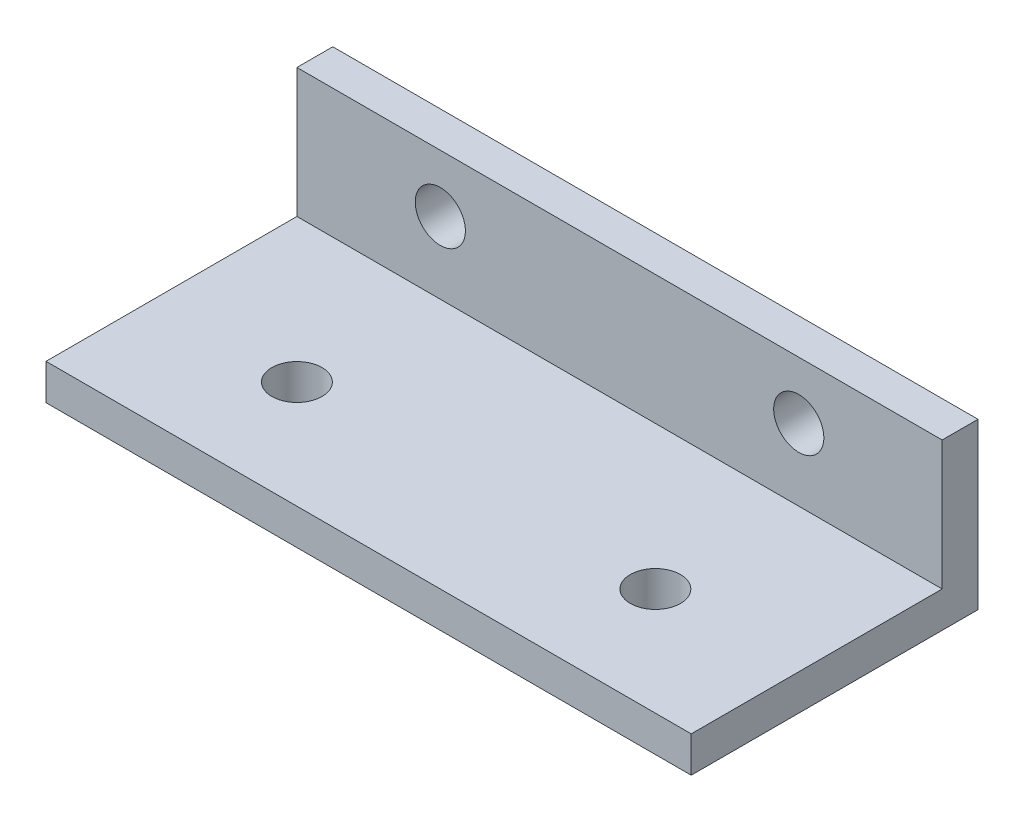
ISO-10303-21;
HEADER;
FILE_DESCRIPTION(('STEP AP214'),'2;1');
FILE_NAME('part.step','',(''),(''),'','','');
FILE_SCHEMA(('AUTOMOTIVE_DESIGN { 1 0 10303 214 1 1 1 1 }'));
ENDSEC;
DATA;
#1=APPLICATION_CONTEXT('core data for automotive mechanical design processes');
#2=APPLICATION_PROTOCOL_DEFINITION('international standard','automotive_design',2000,#1);
#3=PRODUCT_CONTEXT('',#1,'mechanical');
#4=PRODUCT('Part','Part','',(#3));
#5=PRODUCT_RELATED_PRODUCT_CATEGORY('part','',(#4));
#6=PRODUCT_DEFINITION_FORMATION('','',#4);
#7=PRODUCT_DEFINITION_CONTEXT('part definition',#1,'design');
#8=PRODUCT_DEFINITION('design','',#6,#7);
#9=PRODUCT_DEFINITION_SHAPE('','',#8);
#10=(LENGTH_UNIT() NAMED_UNIT(*) SI_UNIT(.MILLI.,.METRE.));
#11=(NAMED_UNIT(*) PLANE_ANGLE_UNIT() SI_UNIT($,.RADIAN.));
#12=(NAMED_UNIT(*) SI_UNIT($,.STERADIAN.) SOLID_ANGLE_UNIT());
#13=UNCERTAINTY_MEASURE_WITH_UNIT(LENGTH_MEASURE(1.E-05),#10,'distance_accuracy_value','');
#14=(GEOMETRIC_REPRESENTATION_CONTEXT(3) GLOBAL_UNCERTAINTY_ASSIGNED_CONTEXT((#13)) GLOBAL_UNIT_ASSIGNED_CONTEXT((#10,
#11,#12)) REPRESENTATION_CONTEXT('',''));
#15=CARTESIAN_POINT('',(0.,0.,0.));
#16=DIRECTION('',(0.,0.,1.));
#17=DIRECTION('',(1.,0.,0.));
#18=AXIS2_PLACEMENT_3D('',#15,#16,#17);
#19=CARTESIAN_POINT('',(45.,0.,5.));
#20=DIRECTION('',(-1.,0.,0.));
#21=DIRECTION('',(0.,-1.,0.));
#22=AXIS2_PLACEMENT_3D('',#19,#20,#21);
#23=PLANE('',#22);
#24=DIRECTION('',(0.,1.,0.));
#25=VECTOR('',#24,1.);
#26=CARTESIAN_POINT('',(45.,0.,0.));
#27=LINE('',#26,#25);
#28=CARTESIAN_POINT('',(45.,-23.,0.));
#29=VERTEX_POINT('',#28);
#30=CARTESIAN_POINT('',(45.,0.,0.));
#31=VERTEX_POINT('',#30);
#32=EDGE_CURVE('E96',#29,#31,#27,.T.);
#33=ORIENTED_EDGE('',*,*,#32,.T.);
#34=DIRECTION('',(0.,0.,-1.));
#35=VECTOR('',#34,1.);
#36=CARTESIAN_POINT('',(45.,0.,5.));
#37=LINE('',#36,#35);
#38=CARTESIAN_POINT('',(45.,0.,5.));
#39=VERTEX_POINT('',#38);
#40=EDGE_CURVE('E11',#39,#31,#37,.T.);
#41=ORIENTED_EDGE('',*,*,#40,.F.);
#42=DIRECTION('',(0.,1.,0.));
#43=VECTOR('',#42,1.);
#44=CARTESIAN_POINT('',(45.,0.,5.));
#45=LINE('',#44,#43);
#46=CARTESIAN_POINT('',(45.,-18.,5.));
#47=VERTEX_POINT('',#46);
#48=EDGE_CURVE('E89',#47,#39,#45,.T.);
#49=ORIENTED_EDGE('',*,*,#48,.F.);
#50=DIRECTION('',(0.,0.,-1.));
#51=VECTOR('',#50,1.);
#52=CARTESIAN_POINT('',(45.,-18.,40.));
#53=LINE('',#52,#51);
#54=CARTESIAN_POINT('',(45.,-18.,40.));
#55=VERTEX_POINT('',#54);
#56=EDGE_CURVE('E104',#55,#47,#53,.T.);
#57=ORIENTED_EDGE('',*,*,#56,.F.);
#58=DIRECTION('',(0.,1.,0.));
#59=VECTOR('',#58,1.);
#60=CARTESIAN_POINT('',(45.,-18.,40.));
#61=LINE('',#60,#59);
#62=CARTESIAN_POINT('',(45.,-23.,40.));
#63=VERTEX_POINT('',#62);
#64=EDGE_CURVE('E99',#63,#55,#61,.T.);
#65=ORIENTED_EDGE('',*,*,#64,.F.);
#66=DIRECTION('',(0.,0.,-1.));
#67=VECTOR('',#66,1.);
#68=CARTESIAN_POINT('',(45.,-23.,5.));
#69=LINE('',#68,#67);
#70=EDGE_CURVE('E82',#63,#29,#69,.T.);
#71=ORIENTED_EDGE('',*,*,#70,.T.);
#72=EDGE_LOOP('',(#33,#41,#49,#57,#65,#71));
#73=FACE_BOUND('',#72,.T.);
#74=ADVANCED_FACE('F37',(#73),#23,.F.);
#75=CARTESIAN_POINT('',(45.,0.,5.));
#76=DIRECTION('',(0.,-1.,0.));
#77=DIRECTION('',(1.,0.,0.));
#78=AXIS2_PLACEMENT_3D('',#75,#76,#77);
#79=PLANE('',#78);
#80=DIRECTION('',(-1.,0.,0.));
#81=VECTOR('',#80,1.);
#82=CARTESIAN_POINT('',(45.,0.,0.));
#83=LINE('',#82,#81);
#84=CARTESIAN_POINT('',(-45.,0.,0.));
#85=VERTEX_POINT('',#84);
#86=EDGE_CURVE('E103',#31,#85,#83,.T.);
#87=ORIENTED_EDGE('',*,*,#86,.T.);
#88=DIRECTION('',(0.,0.,-1.));
#89=VECTOR('',#88,1.);
#90=CARTESIAN_POINT('',(-45.,0.,5.));
#91=LINE('',#90,#89);
#92=CARTESIAN_POINT('',(-45.,0.,5.));
#93=VERTEX_POINT('',#92);
#94=EDGE_CURVE('E44',#93,#85,#91,.T.);
#95=ORIENTED_EDGE('',*,*,#94,.F.);
#96=DIRECTION('',(-1.,0.,0.));
#97=VECTOR('',#96,1.);
#98=CARTESIAN_POINT('',(45.,0.,5.));
#99=LINE('',#98,#97);
#100=EDGE_CURVE('E57',#39,#93,#99,.T.);
#101=ORIENTED_EDGE('',*,*,#100,.F.);
#102=ORIENTED_EDGE('',*,*,#40,.T.);
#103=EDGE_LOOP('',(#87,#95,#101,#102));
#104=FACE_BOUND('',#103,.T.);
#105=ADVANCED_FACE('F120',(#104),#79,.F.);
#106=CARTESIAN_POINT('',(-45.,0.,5.));
#107=DIRECTION('',(1.,0.,0.));
#108=DIRECTION('',(0.,1.,0.));
#109=AXIS2_PLACEMENT_3D('',#106,#107,#108);
#110=PLANE('',#109);
#111=DIRECTION('',(0.,-1.,0.));
#112=VECTOR('',#111,1.);
#113=CARTESIAN_POINT('',(-45.,0.,0.));
#114=LINE('',#113,#112);
#115=CARTESIAN_POINT('',(-45.,-23.,0.));
#116=VERTEX_POINT('',#115);
#117=EDGE_CURVE('E90',#85,#116,#114,.T.);
#118=ORIENTED_EDGE('',*,*,#117,.T.);
#119=DIRECTION('',(0.,0.,-1.));
#120=VECTOR('',#119,1.);
#121=CARTESIAN_POINT('',(-45.,-23.,5.));
#122=LINE('',#121,#120);
#123=CARTESIAN_POINT('',(-45.,-23.,40.));
#124=VERTEX_POINT('',#123);
#125=EDGE_CURVE('E85',#124,#116,#122,.T.);
#126=ORIENTED_EDGE('',*,*,#125,.F.);
#127=DIRECTION('',(0.,-1.,0.));
#128=VECTOR('',#127,1.);
#129=CARTESIAN_POINT('',(-45.,-23.,40.));
#130=LINE('',#129,#128);
#131=CARTESIAN_POINT('',(-45.,-18.,40.));
#132=VERTEX_POINT('',#131);
#133=EDGE_CURVE('E140',#132,#124,#130,.T.);
#134=ORIENTED_EDGE('',*,*,#133,.F.);
#135=DIRECTION('',(0.,0.,-1.));
#136=VECTOR('',#135,1.);
#137=CARTESIAN_POINT('',(-45.,-18.,40.));
#138=LINE('',#137,#136);
#139=CARTESIAN_POINT('',(-45.,-18.,5.));
#140=VERTEX_POINT('',#139);
#141=EDGE_CURVE('E108',#132,#140,#138,.T.);
#142=ORIENTED_EDGE('',*,*,#141,.T.);
#143=DIRECTION('',(0.,-1.,0.));
#144=VECTOR('',#143,1.);
#145=CARTESIAN_POINT('',(-45.,0.,5.));
#146=LINE('',#145,#144);
#147=EDGE_CURVE('E100',#93,#140,#146,.T.);
#148=ORIENTED_EDGE('',*,*,#147,.F.);
#149=ORIENTED_EDGE('',*,*,#94,.T.);
#150=EDGE_LOOP('',(#118,#126,#134,#142,#148,#149));
#151=FACE_BOUND('',#150,.T.);
#152=ADVANCED_FACE('F117',(#151),#110,.F.);
#153=CARTESIAN_POINT('',(-45.,-23.,5.));
#154=DIRECTION('',(0.,1.,0.));
#155=DIRECTION('',(0.,0.,1.));
#156=AXIS2_PLACEMENT_3D('',#153,#154,#155);
#157=PLANE('',#156);
#158=CARTESIAN_POINT('',(-25.,-23.,25.));
#159=DIRECTION('',(0.,1.,0.));
#160=DIRECTION('',(0.,0.,1.));
#161=AXIS2_PLACEMENT_3D('',#158,#159,#160);
#162=CIRCLE('',#161,3.5);
#163=CARTESIAN_POINT('',(-25.,-23.,28.5));
#164=VERTEX_POINT('',#163);
#165=EDGE_CURVE('E167',#164,#164,#162,.T.);
#166=ORIENTED_EDGE('',*,*,#165,.T.);
#167=EDGE_LOOP('',(#166));
#168=FACE_BOUND('',#167,.T.);
#169=CARTESIAN_POINT('',(25.,-23.,25.));
#170=DIRECTION('',(0.,1.,0.));
#171=DIRECTION('',(0.,0.,1.));
#172=AXIS2_PLACEMENT_3D('',#169,#170,#171);
#173=CIRCLE('',#172,3.5);
#174=CARTESIAN_POINT('',(25.,-23.,28.5));
#175=VERTEX_POINT('',#174);
#176=EDGE_CURVE('E161',#175,#175,#173,.T.);
#177=ORIENTED_EDGE('',*,*,#176,.T.);
#178=EDGE_LOOP('',(#177));
#179=FACE_BOUND('',#178,.T.);
#180=DIRECTION('',(1.,0.,0.));
#181=VECTOR('',#180,1.);
#182=CARTESIAN_POINT('',(-45.,-23.,0.));
#183=LINE('',#182,#181);
#184=EDGE_CURVE('E77',#116,#29,#183,.T.);
#185=ORIENTED_EDGE('',*,*,#184,.T.);
#186=ORIENTED_EDGE('',*,*,#70,.F.);
#187=DIRECTION('',(1.,0.,0.));
#188=VECTOR('',#187,1.);
#189=CARTESIAN_POINT('',(45.,-23.,40.));
#190=LINE('',#189,#188);
#191=EDGE_CURVE('E136',#124,#63,#190,.T.);
#192=ORIENTED_EDGE('',*,*,#191,.F.);
#193=ORIENTED_EDGE('',*,*,#125,.T.);
#194=EDGE_LOOP('',(#185,#186,#192,#193));
#195=FACE_BOUND('',#194,.T.);
#196=ADVANCED_FACE('F79',(#168,#179,#195),#157,.F.);
#197=CARTESIAN_POINT('',(0.,0.,5.));
#198=DIRECTION('',(0.,0.,1.));
#199=DIRECTION('',(1.,0.,0.));
#200=AXIS2_PLACEMENT_3D('',#197,#198,#199);
#201=PLANE('',#200);
#202=CARTESIAN_POINT('',(-25.,-8.00000000000002,5.));
#203=DIRECTION('',(0.,0.,1.));
#204=DIRECTION('',(1.,0.,0.));
#205=AXIS2_PLACEMENT_3D('',#202,#203,#204);
#206=CIRCLE('',#205,3.49999999999999);
#207=CARTESIAN_POINT('',(-21.5,-8.00000000000002,5.));
#208=VERTEX_POINT('',#207);
#209=EDGE_CURVE('E158',#208,#208,#206,.T.);
#210=ORIENTED_EDGE('',*,*,#209,.F.);
#211=EDGE_LOOP('',(#210));
#212=FACE_BOUND('',#211,.T.);
#213=CARTESIAN_POINT('',(25.,-8.00000000000001,5.));
#214=DIRECTION('',(0.,0.,1.));
#215=DIRECTION('',(1.,0.,0.));
#216=AXIS2_PLACEMENT_3D('',#213,#214,#215);
#217=CIRCLE('',#216,3.49999999999999);
#218=CARTESIAN_POINT('',(28.5,-8.00000000000001,5.));
#219=VERTEX_POINT('',#218);
#220=EDGE_CURVE('E152',#219,#219,#217,.T.);
#221=ORIENTED_EDGE('',*,*,#220,.F.);
#222=EDGE_LOOP('',(#221));
#223=FACE_BOUND('',#222,.T.);
#224=DIRECTION('',(-1.,0.,0.));
#225=VECTOR('',#224,1.);
#226=CARTESIAN_POINT('',(-45.,-18.,5.));
#227=LINE('',#226,#225);
#228=EDGE_CURVE('E51',#47,#140,#227,.T.);
#229=ORIENTED_EDGE('',*,*,#228,.F.);
#230=ORIENTED_EDGE('',*,*,#48,.T.);
#231=ORIENTED_EDGE('',*,*,#100,.T.);
#232=ORIENTED_EDGE('',*,*,#147,.T.);
#233=EDGE_LOOP('',(#229,#230,#231,#232));
#234=FACE_BOUND('',#233,.T.);
#235=ADVANCED_FACE('F142',(#212,#223,#234),#201,.T.);
#236=CARTESIAN_POINT('',(0.,0.,0.));
#237=DIRECTION('',(0.,0.,1.));
#238=DIRECTION('',(1.,0.,0.));
#239=AXIS2_PLACEMENT_3D('',#236,#237,#238);
#240=PLANE('',#239);
#241=CARTESIAN_POINT('',(-25.,-8.00000000000002,0.));
#242=DIRECTION('',(0.,0.,1.));
#243=DIRECTION('',(1.,0.,0.));
#244=AXIS2_PLACEMENT_3D('',#241,#242,#243);
#245=CIRCLE('',#244,3.5);
#246=CARTESIAN_POINT('',(-21.5,-8.00000000000002,0.));
#247=VERTEX_POINT('',#246);
#248=EDGE_CURVE('E155',#247,#247,#245,.T.);
#249=ORIENTED_EDGE('',*,*,#248,.T.);
#250=EDGE_LOOP('',(#249));
#251=FACE_BOUND('',#250,.T.);
#252=CARTESIAN_POINT('',(25.,-8.00000000000001,0.));
#253=DIRECTION('',(0.,0.,1.));
#254=DIRECTION('',(1.,0.,0.));
#255=AXIS2_PLACEMENT_3D('',#252,#253,#254);
#256=CIRCLE('',#255,3.5);
#257=CARTESIAN_POINT('',(28.5,-8.00000000000001,0.));
#258=VERTEX_POINT('',#257);
#259=EDGE_CURVE('E141',#258,#258,#256,.T.);
#260=ORIENTED_EDGE('',*,*,#259,.T.);
#261=EDGE_LOOP('',(#260));
#262=FACE_BOUND('',#261,.T.);
#263=ORIENTED_EDGE('',*,*,#32,.F.);
#264=ORIENTED_EDGE('',*,*,#184,.F.);
#265=ORIENTED_EDGE('',*,*,#117,.F.);
#266=ORIENTED_EDGE('',*,*,#86,.F.);
#267=EDGE_LOOP('',(#263,#264,#265,#266));
#268=FACE_BOUND('',#267,.T.);
#269=ADVANCED_FACE('F102',(#251,#262,#268),#240,.F.);
#270=CARTESIAN_POINT('',(-45.,-18.,40.));
#271=DIRECTION('',(0.,-1.,0.));
#272=DIRECTION('',(0.,0.,-1.));
#273=AXIS2_PLACEMENT_3D('',#270,#271,#272);
#274=PLANE('',#273);
#275=CARTESIAN_POINT('',(-25.,-18.,25.));
#276=DIRECTION('',(0.,1.,0.));
#277=DIRECTION('',(0.,0.,1.));
#278=AXIS2_PLACEMENT_3D('',#275,#276,#277);
#279=CIRCLE('',#278,3.49999999999999);
#280=CARTESIAN_POINT('',(-25.,-18.,28.5));
#281=VERTEX_POINT('',#280);
#282=EDGE_CURVE('E170',#281,#281,#279,.T.);
#283=ORIENTED_EDGE('',*,*,#282,.F.);
#284=EDGE_LOOP('',(#283));
#285=FACE_BOUND('',#284,.T.);
#286=CARTESIAN_POINT('',(25.,-18.,25.));
#287=DIRECTION('',(0.,1.,0.));
#288=DIRECTION('',(0.,0.,1.));
#289=AXIS2_PLACEMENT_3D('',#286,#287,#288);
#290=CIRCLE('',#289,3.49999999999999);
#291=CARTESIAN_POINT('',(25.,-18.,28.5));
#292=VERTEX_POINT('',#291);
#293=EDGE_CURVE('E164',#292,#292,#290,.T.);
#294=ORIENTED_EDGE('',*,*,#293,.F.);
#295=EDGE_LOOP('',(#294));
#296=FACE_BOUND('',#295,.T.);
#297=ORIENTED_EDGE('',*,*,#228,.T.);
#298=ORIENTED_EDGE('',*,*,#141,.F.);
#299=DIRECTION('',(-1.,0.,0.));
#300=VECTOR('',#299,1.);
#301=CARTESIAN_POINT('',(-45.,-18.,40.));
#302=LINE('',#301,#300);
#303=EDGE_CURVE('E129',#55,#132,#302,.T.);
#304=ORIENTED_EDGE('',*,*,#303,.F.);
#305=ORIENTED_EDGE('',*,*,#56,.T.);
#306=EDGE_LOOP('',(#297,#298,#304,#305));
#307=FACE_BOUND('',#306,.T.);
#308=ADVANCED_FACE('F125',(#285,#296,#307),#274,.F.);
#309=CARTESIAN_POINT('',(0.,0.,40.));
#310=DIRECTION('',(0.,0.,-1.));
#311=DIRECTION('',(-1.,0.,0.));
#312=AXIS2_PLACEMENT_3D('',#309,#310,#311);
#313=PLANE('',#312);
#314=ORIENTED_EDGE('',*,*,#133,.T.);
#315=ORIENTED_EDGE('',*,*,#191,.T.);
#316=ORIENTED_EDGE('',*,*,#64,.T.);
#317=ORIENTED_EDGE('',*,*,#303,.T.);
#318=EDGE_LOOP('',(#314,#315,#316,#317));
#319=FACE_BOUND('',#318,.T.);
#320=ADVANCED_FACE('F147',(#319),#313,.F.);
#321=CARTESIAN_POINT('',(25.,-8.00000000000001,5.));
#322=DIRECTION('',(0.,0.,1.));
#323=DIRECTION('',(1.,0.,0.));
#324=AXIS2_PLACEMENT_3D('',#321,#322,#323);
#325=CYLINDRICAL_SURFACE('',#324,3.49999999999999);
#326=ORIENTED_EDGE('',*,*,#259,.F.);
#327=EDGE_LOOP('',(#326));
#328=FACE_BOUND('',#327,.T.);
#329=ORIENTED_EDGE('',*,*,#220,.T.);
#330=EDGE_LOOP('',(#329));
#331=FACE_BOUND('',#330,.T.);
#332=ADVANCED_FACE('F192',(#328,#331),#325,.F.);
#333=CARTESIAN_POINT('',(-25.,-8.00000000000002,5.));
#334=DIRECTION('',(0.,0.,1.));
#335=DIRECTION('',(1.,0.,0.));
#336=AXIS2_PLACEMENT_3D('',#333,#334,#335);
#337=CYLINDRICAL_SURFACE('',#336,3.49999999999999);
#338=ORIENTED_EDGE('',*,*,#248,.F.);
#339=EDGE_LOOP('',(#338));
#340=FACE_BOUND('',#339,.T.);
#341=ORIENTED_EDGE('',*,*,#209,.T.);
#342=EDGE_LOOP('',(#341));
#343=FACE_BOUND('',#342,.T.);
#344=ADVANCED_FACE('F183',(#340,#343),#337,.F.);
#345=CARTESIAN_POINT('',(25.,-18.,25.));
#346=DIRECTION('',(0.,1.,0.));
#347=DIRECTION('',(0.,0.,1.));
#348=AXIS2_PLACEMENT_3D('',#345,#346,#347);
#349=CYLINDRICAL_SURFACE('',#348,3.49999999999999);
#350=ORIENTED_EDGE('',*,*,#176,.F.);
#351=EDGE_LOOP('',(#350));
#352=FACE_BOUND('',#351,.T.);
#353=ORIENTED_EDGE('',*,*,#293,.T.);
#354=EDGE_LOOP('',(#353));
#355=FACE_BOUND('',#354,.T.);
#356=ADVANCED_FACE('F181',(#352,#355),#349,.F.);
#357=CARTESIAN_POINT('',(-25.,-18.,25.));
#358=DIRECTION('',(0.,1.,0.));
#359=DIRECTION('',(0.,0.,1.));
#360=AXIS2_PLACEMENT_3D('',#357,#358,#359);
#361=CYLINDRICAL_SURFACE('',#360,3.49999999999999);
#362=ORIENTED_EDGE('',*,*,#165,.F.);
#363=EDGE_LOOP('',(#362));
#364=FACE_BOUND('',#363,.T.);
#365=ORIENTED_EDGE('',*,*,#282,.T.);
#366=EDGE_LOOP('',(#365));
#367=FACE_BOUND('',#366,.T.);
#368=ADVANCED_FACE('F174',(#364,#367),#361,.F.);
#369=CLOSED_SHELL('',(#74,#105,#152,#196,#235,#269,#308,#320,#332,#344,#356,#368));
#370=MANIFOLD_SOLID_BREP('B2',#369);
#371=ADVANCED_BREP_SHAPE_REPRESENTATION('',(#18,#370),#14);
#372=SHAPE_DEFINITION_REPRESENTATION(#9,#371);
ENDSEC;
END-ISO-10303-21;
